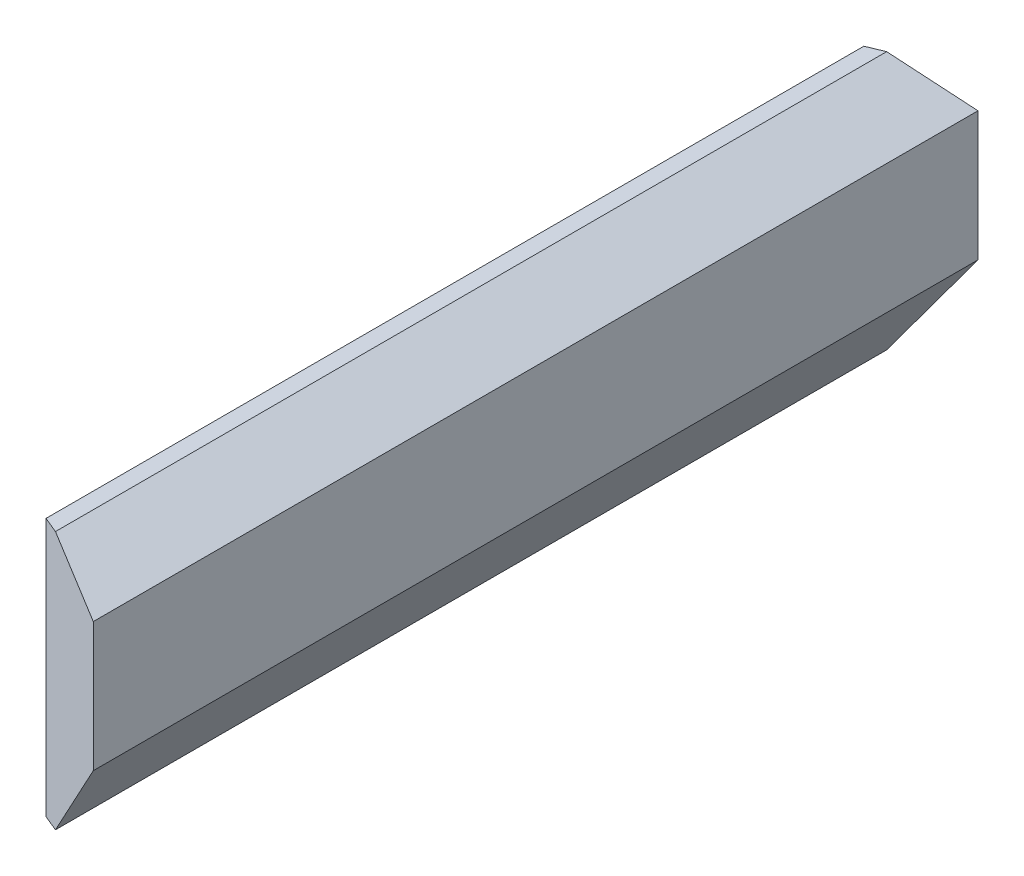
ISO-10303-21;
HEADER;
FILE_DESCRIPTION(('STEP AP214'),'2;1');
FILE_NAME('part.step','',(''),(''),'','','');
FILE_SCHEMA(('AUTOMOTIVE_DESIGN { 1 0 10303 214 1 1 1 1 }'));
ENDSEC;
DATA;
#1=APPLICATION_CONTEXT('core data for automotive mechanical design processes');
#2=APPLICATION_PROTOCOL_DEFINITION('international standard','automotive_design',2000,#1);
#3=PRODUCT_CONTEXT('',#1,'mechanical');
#4=PRODUCT('Part','Part','',(#3));
#5=PRODUCT_RELATED_PRODUCT_CATEGORY('part','',(#4));
#6=PRODUCT_DEFINITION_FORMATION('','',#4);
#7=PRODUCT_DEFINITION_CONTEXT('part definition',#1,'design');
#8=PRODUCT_DEFINITION('design','',#6,#7);
#9=PRODUCT_DEFINITION_SHAPE('','',#8);
#10=(LENGTH_UNIT() NAMED_UNIT(*) SI_UNIT(.MILLI.,.METRE.));
#11=(NAMED_UNIT(*) PLANE_ANGLE_UNIT() SI_UNIT($,.RADIAN.));
#12=(NAMED_UNIT(*) SI_UNIT($,.STERADIAN.) SOLID_ANGLE_UNIT());
#13=UNCERTAINTY_MEASURE_WITH_UNIT(LENGTH_MEASURE(1.E-05),#10,'distance_accuracy_value','');
#14=(GEOMETRIC_REPRESENTATION_CONTEXT(3) GLOBAL_UNCERTAINTY_ASSIGNED_CONTEXT((#13)) GLOBAL_UNIT_ASSIGNED_CONTEXT((#10,
#11,#12)) REPRESENTATION_CONTEXT('',''));
#15=CARTESIAN_POINT('',(0.,0.,0.));
#16=DIRECTION('',(0.,0.,1.));
#17=DIRECTION('',(1.,0.,0.));
#18=AXIS2_PLACEMENT_3D('',#15,#16,#17);
#19=CARTESIAN_POINT('',(0.,0.,300.));
#20=DIRECTION('',(1.,0.,0.));
#21=DIRECTION('',(0.,0.,-1.));
#22=AXIS2_PLACEMENT_3D('',#19,#20,#21);
#23=PLANE('',#22);
#24=DIRECTION('',(0.,0.,1.));
#25=VECTOR('',#24,1.);
#26=CARTESIAN_POINT('',(0.,5.,153.65));
#27=LINE('',#26,#25);
#28=CARTESIAN_POINT('',(0.,5.,153.65));
#29=VERTEX_POINT('',#28);
#30=CARTESIAN_POINT('',(0.,5.,213.65));
#31=VERTEX_POINT('',#30);
#32=EDGE_CURVE('E296',#29,#31,#27,.T.);
#33=ORIENTED_EDGE('',*,*,#32,.F.);
#34=DIRECTION('',(0.,-1.,0.));
#35=VECTOR('',#34,1.);
#36=CARTESIAN_POINT('',(0.,5.,153.65));
#37=LINE('',#36,#35);
#38=CARTESIAN_POINT('',(0.,75.,153.65));
#39=VERTEX_POINT('',#38);
#40=EDGE_CURVE('E325',#39,#29,#37,.T.);
#41=ORIENTED_EDGE('',*,*,#40,.F.);
#42=DIRECTION('',(0.,0.,1.));
#43=VECTOR('',#42,1.);
#44=CARTESIAN_POINT('',(0.,75.,153.65));
#45=LINE('',#44,#43);
#46=CARTESIAN_POINT('',(0.,75.,213.65));
#47=VERTEX_POINT('',#46);
#48=EDGE_CURVE('E346',#39,#47,#45,.T.);
#49=ORIENTED_EDGE('',*,*,#48,.T.);
#50=DIRECTION('',(0.,-1.,0.));
#51=VECTOR('',#50,1.);
#52=CARTESIAN_POINT('',(0.,5.,213.65));
#53=LINE('',#52,#51);
#54=EDGE_CURVE('E309',#47,#31,#53,.T.);
#55=ORIENTED_EDGE('',*,*,#54,.T.);
#56=EDGE_LOOP('',(#33,#41,#49,#55));
#57=FACE_BOUND('',#56,.T.);
#58=DIRECTION('',(0.,-1.,0.));
#59=VECTOR('',#58,1.);
#60=CARTESIAN_POINT('',(0.,5.,146.35));
#61=LINE('',#60,#59);
#62=CARTESIAN_POINT('',(0.,75.,146.35));
#63=VERTEX_POINT('',#62);
#64=CARTESIAN_POINT('',(0.,5.,146.35));
#65=VERTEX_POINT('',#64);
#66=EDGE_CURVE('E439',#63,#65,#61,.T.);
#67=ORIENTED_EDGE('',*,*,#66,.T.);
#68=DIRECTION('',(0.,0.,-1.));
#69=VECTOR('',#68,1.);
#70=CARTESIAN_POINT('',(0.,5.,146.35));
#71=LINE('',#70,#69);
#72=CARTESIAN_POINT('',(0.,5.,86.35));
#73=VERTEX_POINT('',#72);
#74=EDGE_CURVE('E477',#65,#73,#71,.T.);
#75=ORIENTED_EDGE('',*,*,#74,.T.);
#76=DIRECTION('',(0.,-1.,0.));
#77=VECTOR('',#76,1.);
#78=CARTESIAN_POINT('',(0.,5.,86.35));
#79=LINE('',#78,#77);
#80=CARTESIAN_POINT('',(0.,75.,86.35));
#81=VERTEX_POINT('',#80);
#82=EDGE_CURVE('E419',#81,#73,#79,.T.);
#83=ORIENTED_EDGE('',*,*,#82,.F.);
#84=DIRECTION('',(0.,0.,-1.));
#85=VECTOR('',#84,1.);
#86=CARTESIAN_POINT('',(0.,75.,146.35));
#87=LINE('',#86,#85);
#88=EDGE_CURVE('E458',#63,#81,#87,.T.);
#89=ORIENTED_EDGE('',*,*,#88,.F.);
#90=EDGE_LOOP('',(#67,#75,#83,#89));
#91=FACE_BOUND('',#90,.T.);
#92=DIRECTION('',(0.,0.,-1.));
#93=VECTOR('',#92,1.);
#94=CARTESIAN_POINT('',(0.,80.,300.));
#95=LINE('',#94,#93);
#96=CARTESIAN_POINT('',(0.,80.,276.65));
#97=VERTEX_POINT('',#96);
#98=CARTESIAN_POINT('',(0.,80.,23.35));
#99=VERTEX_POINT('',#98);
#100=EDGE_CURVE('E587',#97,#99,#95,.T.);
#101=ORIENTED_EDGE('',*,*,#100,.T.);
#102=DIRECTION('',(0.,1.,0.));
#103=VECTOR('',#102,1.);
#104=CARTESIAN_POINT('',(0.,-210.,23.35));
#105=LINE('',#104,#103);
#106=CARTESIAN_POINT('',(0.,0.,23.35));
#107=VERTEX_POINT('',#106);
#108=EDGE_CURVE('E545',#107,#99,#105,.T.);
#109=ORIENTED_EDGE('',*,*,#108,.F.);
#110=DIRECTION('',(0.,0.,-1.));
#111=VECTOR('',#110,1.);
#112=CARTESIAN_POINT('',(0.,0.,300.));
#113=LINE('',#112,#111);
#114=CARTESIAN_POINT('',(0.,0.,276.65));
#115=VERTEX_POINT('',#114);
#116=EDGE_CURVE('E583',#115,#107,#113,.T.);
#117=ORIENTED_EDGE('',*,*,#116,.F.);
#118=DIRECTION('',(0.,1.,0.));
#119=VECTOR('',#118,1.);
#120=CARTESIAN_POINT('',(0.,-210.,276.65));
#121=LINE('',#120,#119);
#122=EDGE_CURVE('E565',#115,#97,#121,.T.);
#123=ORIENTED_EDGE('',*,*,#122,.T.);
#124=EDGE_LOOP('',(#101,#109,#117,#123));
#125=FACE_BOUND('',#124,.T.);
#126=DIRECTION('',(0.,-1.,0.));
#127=VECTOR('',#126,1.);
#128=CARTESIAN_POINT('',(0.,5.,81.35));
#129=LINE('',#128,#127);
#130=CARTESIAN_POINT('',(0.,75.,81.35));
#131=VERTEX_POINT('',#130);
#132=CARTESIAN_POINT('',(0.,5.,81.35));
#133=VERTEX_POINT('',#132);
#134=EDGE_CURVE('E501',#131,#133,#129,.T.);
#135=ORIENTED_EDGE('',*,*,#134,.T.);
#136=DIRECTION('',(0.,0.,-1.));
#137=VECTOR('',#136,1.);
#138=CARTESIAN_POINT('',(0.,5.,81.35));
#139=LINE('',#138,#137);
#140=CARTESIAN_POINT('',(0.,5.,28.35));
#141=VERTEX_POINT('',#140);
#142=EDGE_CURVE('E538',#133,#141,#139,.T.);
#143=ORIENTED_EDGE('',*,*,#142,.T.);
#144=DIRECTION('',(0.,-1.,0.));
#145=VECTOR('',#144,1.);
#146=CARTESIAN_POINT('',(0.,5.,28.35));
#147=LINE('',#146,#145);
#148=CARTESIAN_POINT('',(0.,75.,28.35));
#149=VERTEX_POINT('',#148);
#150=EDGE_CURVE('E481',#149,#141,#147,.T.);
#151=ORIENTED_EDGE('',*,*,#150,.F.);
#152=DIRECTION('',(0.,0.,-1.));
#153=VECTOR('',#152,1.);
#154=CARTESIAN_POINT('',(0.,75.,81.35));
#155=LINE('',#154,#153);
#156=EDGE_CURVE('E520',#131,#149,#155,.T.);
#157=ORIENTED_EDGE('',*,*,#156,.F.);
#158=EDGE_LOOP('',(#135,#143,#151,#157));
#159=FACE_BOUND('',#158,.T.);
#160=DIRECTION('',(0.,-1.,0.));
#161=VECTOR('',#160,1.);
#162=CARTESIAN_POINT('',(0.,5.,271.65));
#163=LINE('',#162,#161);
#164=CARTESIAN_POINT('',(0.,75.,271.65));
#165=VERTEX_POINT('',#164);
#166=CARTESIAN_POINT('',(0.,5.,271.65));
#167=VERTEX_POINT('',#166);
#168=EDGE_CURVE('E379',#165,#167,#163,.T.);
#169=ORIENTED_EDGE('',*,*,#168,.T.);
#170=DIRECTION('',(0.,0.,-1.));
#171=VECTOR('',#170,1.);
#172=CARTESIAN_POINT('',(0.,5.,271.65));
#173=LINE('',#172,#171);
#174=CARTESIAN_POINT('',(0.,5.,218.65));
#175=VERTEX_POINT('',#174);
#176=EDGE_CURVE('E415',#167,#175,#173,.T.);
#177=ORIENTED_EDGE('',*,*,#176,.T.);
#178=DIRECTION('',(0.,-1.,0.));
#179=VECTOR('',#178,1.);
#180=CARTESIAN_POINT('',(0.,5.,218.65));
#181=LINE('',#180,#179);
#182=CARTESIAN_POINT('',(0.,75.,218.65));
#183=VERTEX_POINT('',#182);
#184=EDGE_CURVE('E350',#183,#175,#181,.T.);
#185=ORIENTED_EDGE('',*,*,#184,.F.);
#186=DIRECTION('',(0.,0.,-1.));
#187=VECTOR('',#186,1.);
#188=CARTESIAN_POINT('',(0.,75.,271.65));
#189=LINE('',#188,#187);
#190=EDGE_CURVE('E70',#165,#183,#189,.T.);
#191=ORIENTED_EDGE('',*,*,#190,.F.);
#192=EDGE_LOOP('',(#169,#177,#185,#191));
#193=FACE_BOUND('',#192,.T.);
#194=ADVANCED_FACE('F40',(#57,#91,#125,#159,#193),#23,.F.);
#195=CARTESIAN_POINT('',(5.,0.,300.));
#196=DIRECTION('',(0.,1.,0.));
#197=DIRECTION('',(-1.,0.,0.));
#198=AXIS2_PLACEMENT_3D('',#195,#196,#197);
#199=PLANE('',#198);
#200=ORIENTED_EDGE('',*,*,#116,.T.);
#201=DIRECTION('',(0.923879532511288,0.,-0.382683432365088));
#202=VECTOR('',#201,1.);
#203=CARTESIAN_POINT('',(-93.5427785546623,0.,62.096687539404));
#204=LINE('',#203,#202);
#205=CARTESIAN_POINT('',(5.,0.,21.2789321881345));
#206=VERTEX_POINT('',#205);
#207=EDGE_CURVE('E558',#107,#206,#204,.T.);
#208=ORIENTED_EDGE('',*,*,#207,.T.);
#209=DIRECTION('',(0.,0.,-1.));
#210=VECTOR('',#209,1.);
#211=CARTESIAN_POINT('',(5.,0.,300.));
#212=LINE('',#211,#210);
#213=CARTESIAN_POINT('',(5.,0.,278.721067811866));
#214=VERTEX_POINT('',#213);
#215=EDGE_CURVE('E11',#214,#206,#212,.T.);
#216=ORIENTED_EDGE('',*,*,#215,.F.);
#217=DIRECTION('',(-0.923879532511285,0.,-0.382683432365094));
#218=VECTOR('',#217,1.);
#219=CARTESIAN_POINT('',(12.5232386233194,0.,281.837295282614));
#220=LINE('',#219,#218);
#221=EDGE_CURVE('E580',#214,#115,#220,.T.);
#222=ORIENTED_EDGE('',*,*,#221,.T.);
#223=EDGE_LOOP('',(#200,#208,#216,#222));
#224=FACE_BOUND('',#223,.T.);
#225=ADVANCED_FACE('F42',(#224),#199,.F.);
#226=CARTESIAN_POINT('',(25.,30.,300.));
#227=DIRECTION('',(-0.832050294337844,0.554700196225229,0.));
#228=DIRECTION('',(-0.554700196225229,-0.832050294337844,0.));
#229=AXIS2_PLACEMENT_3D('',#226,#227,#228);
#230=PLANE('',#229);
#231=ORIENTED_EDGE('',*,*,#215,.T.);
#232=DIRECTION('',(0.540613769225996,0.810920653838994,-0.223929555219045));
#233=VECTOR('',#232,1.);
#234=CARTESIAN_POINT('',(-9.74469439819915,-22.1170415972987,27.3863845809151));
#235=LINE('',#234,#233);
#236=CARTESIAN_POINT('',(25.,30.,12.9946609406727));
#237=VERTEX_POINT('',#236);
#238=EDGE_CURVE('E554',#206,#237,#235,.T.);
#239=ORIENTED_EDGE('',*,*,#238,.T.);
#240=DIRECTION('',(0.,0.,-1.));
#241=VECTOR('',#240,1.);
#242=CARTESIAN_POINT('',(25.,30.,300.));
#243=LINE('',#242,#241);
#244=CARTESIAN_POINT('',(25.,30.,287.005339059328));
#245=VERTEX_POINT('',#244);
#246=EDGE_CURVE('E49',#245,#237,#243,.T.);
#247=ORIENTED_EDGE('',*,*,#246,.F.);
#248=DIRECTION('',(-0.540613769225996,-0.810920653838993,-0.223929555219049));
#249=VECTOR('',#248,1.);
#250=CARTESIAN_POINT('',(26.5731258682214,32.3596888023321,287.656949129265));
#251=LINE('',#250,#249);
#252=EDGE_CURVE('E577',#245,#214,#251,.T.);
#253=ORIENTED_EDGE('',*,*,#252,.T.);
#254=EDGE_LOOP('',(#231,#239,#247,#253));
#255=FACE_BOUND('',#254,.T.);
#256=ADVANCED_FACE('F605',(#255),#230,.F.);
#257=CARTESIAN_POINT('',(25.,70.,300.));
#258=DIRECTION('',(-1.,0.,0.));
#259=DIRECTION('',(0.,-1.,0.));
#260=AXIS2_PLACEMENT_3D('',#257,#258,#259);
#261=PLANE('',#260);
#262=ORIENTED_EDGE('',*,*,#246,.T.);
#263=DIRECTION('',(0.,1.,0.));
#264=VECTOR('',#263,1.);
#265=CARTESIAN_POINT('',(25.,70.,12.9946609406727));
#266=LINE('',#265,#264);
#267=CARTESIAN_POINT('',(25.,70.,12.9946609406727));
#268=VERTEX_POINT('',#267);
#269=EDGE_CURVE('E551',#237,#268,#266,.T.);
#270=ORIENTED_EDGE('',*,*,#269,.T.);
#271=DIRECTION('',(0.,0.,-1.));
#272=VECTOR('',#271,1.);
#273=CARTESIAN_POINT('',(25.,70.,300.));
#274=LINE('',#273,#272);
#275=CARTESIAN_POINT('',(25.,70.,287.005339059328));
#276=VERTEX_POINT('',#275);
#277=EDGE_CURVE('E595',#276,#268,#274,.T.);
#278=ORIENTED_EDGE('',*,*,#277,.F.);
#279=DIRECTION('',(0.,-1.,0.));
#280=VECTOR('',#279,1.);
#281=CARTESIAN_POINT('',(25.,70.,287.005339059328));
#282=LINE('',#281,#280);
#283=EDGE_CURVE('E573',#276,#245,#282,.T.);
#284=ORIENTED_EDGE('',*,*,#283,.T.);
#285=EDGE_LOOP('',(#262,#270,#278,#284));
#286=FACE_BOUND('',#285,.T.);
#287=ADVANCED_FACE('F602',(#286),#261,.F.);
#288=CARTESIAN_POINT('',(5.,80.,300.));
#289=DIRECTION('',(-0.447213595499958,-0.894427190999916,0.));
#290=DIRECTION('',(0.894427190999916,-0.447213595499958,0.));
#291=AXIS2_PLACEMENT_3D('',#288,#289,#290);
#292=PLANE('',#291);
#293=ORIENTED_EDGE('',*,*,#277,.T.);
#294=DIRECTION('',(-0.838716980803311,0.419358490401655,0.347407948441344));
#295=VECTOR('',#294,1.);
#296=CARTESIAN_POINT('',(-76.2128934200243,120.606446710012,54.9184140822691));
#297=LINE('',#296,#295);
#298=CARTESIAN_POINT('',(5.00000000000003,80.,21.2789321881345));
#299=VERTEX_POINT('',#298);
#300=EDGE_CURVE('E548',#268,#299,#297,.T.);
#301=ORIENTED_EDGE('',*,*,#300,.T.);
#302=DIRECTION('',(0.,0.,-1.));
#303=VECTOR('',#302,1.);
#304=CARTESIAN_POINT('',(5.,80.,300.));
#305=LINE('',#304,#303);
#306=CARTESIAN_POINT('',(5.,80.,278.721067811866));
#307=VERTEX_POINT('',#306);
#308=EDGE_CURVE('E591',#307,#299,#305,.T.);
#309=ORIENTED_EDGE('',*,*,#308,.F.);
#310=DIRECTION('',(0.838716980803309,-0.419358490401654,0.34740794844135));
#311=VECTOR('',#310,1.);
#312=CARTESIAN_POINT('',(11.2001902671146,76.8999048664427,281.289270709798));
#313=LINE('',#312,#311);
#314=EDGE_CURVE('E569',#307,#276,#313,.T.);
#315=ORIENTED_EDGE('',*,*,#314,.T.);
#316=EDGE_LOOP('',(#293,#301,#309,#315));
#317=FACE_BOUND('',#316,.T.);
#318=ADVANCED_FACE('F621',(#317),#292,.F.);
#319=CARTESIAN_POINT('',(0.,80.,300.));
#320=DIRECTION('',(0.,-1.,0.));
#321=DIRECTION('',(0.,0.,-1.));
#322=AXIS2_PLACEMENT_3D('',#319,#320,#321);
#323=PLANE('',#322);
#324=ORIENTED_EDGE('',*,*,#308,.T.);
#325=DIRECTION('',(0.923879532511288,0.,-0.382683432365088));
#326=VECTOR('',#325,1.);
#327=CARTESIAN_POINT('',(0.,80.,23.35));
#328=LINE('',#327,#326);
#329=EDGE_CURVE('E542',#99,#299,#328,.T.);
#330=ORIENTED_EDGE('',*,*,#329,.F.);
#331=ORIENTED_EDGE('',*,*,#100,.F.);
#332=DIRECTION('',(-0.923879532511285,0.,-0.382683432365094));
#333=VECTOR('',#332,1.);
#334=CARTESIAN_POINT('',(0.,80.,276.65));
#335=LINE('',#334,#333);
#336=EDGE_CURVE('E562',#307,#97,#335,.T.);
#337=ORIENTED_EDGE('',*,*,#336,.F.);
#338=EDGE_LOOP('',(#324,#330,#331,#337));
#339=FACE_BOUND('',#338,.T.);
#340=ADVANCED_FACE('F617',(#339),#323,.F.);
#341=CARTESIAN_POINT('',(0.,-210.,276.65));
#342=DIRECTION('',(0.382683432365094,0.,-0.923879532511285));
#343=DIRECTION('',(-0.923879532511285,0.,-0.382683432365094));
#344=AXIS2_PLACEMENT_3D('',#341,#342,#343);
#345=PLANE('',#344);
#346=ORIENTED_EDGE('',*,*,#252,.F.);
#347=ORIENTED_EDGE('',*,*,#283,.F.);
#348=ORIENTED_EDGE('',*,*,#314,.F.);
#349=ORIENTED_EDGE('',*,*,#336,.T.);
#350=ORIENTED_EDGE('',*,*,#122,.F.);
#351=ORIENTED_EDGE('',*,*,#221,.F.);
#352=EDGE_LOOP('',(#346,#347,#348,#349,#350,#351));
#353=FACE_BOUND('',#352,.T.);
#354=ADVANCED_FACE('F623',(#353),#345,.F.);
#355=CARTESIAN_POINT('',(0.,-210.,23.35));
#356=DIRECTION('',(0.382683432365088,0.,0.923879532511288));
#357=DIRECTION('',(0.923879532511288,0.,-0.382683432365088));
#358=AXIS2_PLACEMENT_3D('',#355,#356,#357);
#359=PLANE('',#358);
#360=ORIENTED_EDGE('',*,*,#108,.T.);
#361=ORIENTED_EDGE('',*,*,#329,.T.);
#362=ORIENTED_EDGE('',*,*,#300,.F.);
#363=ORIENTED_EDGE('',*,*,#269,.F.);
#364=ORIENTED_EDGE('',*,*,#238,.F.);
#365=ORIENTED_EDGE('',*,*,#207,.F.);
#366=EDGE_LOOP('',(#360,#361,#362,#363,#364,#365));
#367=FACE_BOUND('',#366,.T.);
#368=ADVANCED_FACE('F608',(#367),#359,.F.);
#369=CARTESIAN_POINT('',(3.52593163271468,5.,81.35));
#370=DIRECTION('',(0.,1.,0.));
#371=DIRECTION('',(-1.,0.,0.));
#372=AXIS2_PLACEMENT_3D('',#369,#370,#371);
#373=PLANE('',#372);
#374=DIRECTION('',(1.,0.,0.));
#375=VECTOR('',#374,1.);
#376=CARTESIAN_POINT('',(3.52593163271468,5.,28.35));
#377=LINE('',#376,#375);
#378=CARTESIAN_POINT('',(3.52593163271468,5.,28.35));
#379=VERTEX_POINT('',#378);
#380=EDGE_CURVE('E485',#141,#379,#377,.T.);
#381=ORIENTED_EDGE('',*,*,#380,.F.);
#382=ORIENTED_EDGE('',*,*,#142,.F.);
#383=DIRECTION('',(1.,0.,0.));
#384=VECTOR('',#383,1.);
#385=CARTESIAN_POINT('',(3.52593163271468,5.,81.35));
#386=LINE('',#385,#384);
#387=CARTESIAN_POINT('',(3.52593163271468,5.,81.35));
#388=VERTEX_POINT('',#387);
#389=EDGE_CURVE('E505',#133,#388,#386,.T.);
#390=ORIENTED_EDGE('',*,*,#389,.T.);
#391=DIRECTION('',(0.,0.,-1.));
#392=VECTOR('',#391,1.);
#393=CARTESIAN_POINT('',(3.52593163271468,5.,81.35));
#394=LINE('',#393,#392);
#395=EDGE_CURVE('E534',#388,#379,#394,.T.);
#396=ORIENTED_EDGE('',*,*,#395,.T.);
#397=EDGE_LOOP('',(#381,#382,#390,#396));
#398=FACE_BOUND('',#397,.T.);
#399=ADVANCED_FACE('F630',(#398),#373,.T.);
#400=CARTESIAN_POINT('',(21.,31.211102550928,81.35));
#401=DIRECTION('',(-0.832050294337844,0.554700196225229,0.));
#402=DIRECTION('',(-0.554700196225229,-0.832050294337844,0.));
#403=AXIS2_PLACEMENT_3D('',#400,#401,#402);
#404=PLANE('',#403);
#405=DIRECTION('',(0.554700196225229,0.832050294337844,0.));
#406=VECTOR('',#405,1.);
#407=CARTESIAN_POINT('',(21.,31.211102550928,28.35));
#408=LINE('',#407,#406);
#409=CARTESIAN_POINT('',(21.,31.211102550928,28.35));
#410=VERTEX_POINT('',#409);
#411=EDGE_CURVE('E488',#379,#410,#408,.T.);
#412=ORIENTED_EDGE('',*,*,#411,.F.);
#413=ORIENTED_EDGE('',*,*,#395,.F.);
#414=DIRECTION('',(0.554700196225229,0.832050294337844,0.));
#415=VECTOR('',#414,1.);
#416=CARTESIAN_POINT('',(21.,31.211102550928,81.35));
#417=LINE('',#416,#415);
#418=CARTESIAN_POINT('',(21.,31.211102550928,81.35));
#419=VERTEX_POINT('',#418);
#420=EDGE_CURVE('E508',#388,#419,#417,.T.);
#421=ORIENTED_EDGE('',*,*,#420,.T.);
#422=DIRECTION('',(0.,0.,-1.));
#423=VECTOR('',#422,1.);
#424=CARTESIAN_POINT('',(21.,31.211102550928,81.35));
#425=LINE('',#424,#423);
#426=EDGE_CURVE('E531',#419,#410,#425,.T.);
#427=ORIENTED_EDGE('',*,*,#426,.T.);
#428=EDGE_LOOP('',(#412,#413,#421,#427));
#429=FACE_BOUND('',#428,.T.);
#430=ADVANCED_FACE('F841',(#429),#404,.T.);
#431=CARTESIAN_POINT('',(21.,67.5278640450004,81.35));
#432=DIRECTION('',(-1.,0.,0.));
#433=DIRECTION('',(0.,-1.,0.));
#434=AXIS2_PLACEMENT_3D('',#431,#432,#433);
#435=PLANE('',#434);
#436=DIRECTION('',(0.,1.,0.));
#437=VECTOR('',#436,1.);
#438=CARTESIAN_POINT('',(21.,67.5278640450004,28.35));
#439=LINE('',#438,#437);
#440=CARTESIAN_POINT('',(21.,67.5278640450004,28.35));
#441=VERTEX_POINT('',#440);
#442=EDGE_CURVE('E491',#410,#441,#439,.T.);
#443=ORIENTED_EDGE('',*,*,#442,.F.);
#444=ORIENTED_EDGE('',*,*,#426,.F.);
#445=DIRECTION('',(0.,1.,0.));
#446=VECTOR('',#445,1.);
#447=CARTESIAN_POINT('',(21.,67.5278640450004,81.35));
#448=LINE('',#447,#446);
#449=CARTESIAN_POINT('',(21.,67.5278640450004,81.35));
#450=VERTEX_POINT('',#449);
#451=EDGE_CURVE('E511',#419,#450,#448,.T.);
#452=ORIENTED_EDGE('',*,*,#451,.T.);
#453=DIRECTION('',(0.,0.,-1.));
#454=VECTOR('',#453,1.);
#455=CARTESIAN_POINT('',(21.,67.5278640450004,81.35));
#456=LINE('',#455,#454);
#457=EDGE_CURVE('E527',#450,#441,#456,.T.);
#458=ORIENTED_EDGE('',*,*,#457,.T.);
#459=EDGE_LOOP('',(#443,#444,#452,#458));
#460=FACE_BOUND('',#459,.T.);
#461=ADVANCED_FACE('F837',(#460),#435,.T.);
#462=CARTESIAN_POINT('',(6.05572809000084,75.,81.35));
#463=DIRECTION('',(-0.447213595499958,-0.894427190999916,0.));
#464=DIRECTION('',(0.894427190999916,-0.447213595499958,0.));
#465=AXIS2_PLACEMENT_3D('',#462,#463,#464);
#466=PLANE('',#465);
#467=DIRECTION('',(-0.894427190999916,0.447213595499958,0.));
#468=VECTOR('',#467,1.);
#469=CARTESIAN_POINT('',(6.05572809000084,75.,28.35));
#470=LINE('',#469,#468);
#471=CARTESIAN_POINT('',(6.05572809000084,75.,28.35));
#472=VERTEX_POINT('',#471);
#473=EDGE_CURVE('E494',#441,#472,#470,.T.);
#474=ORIENTED_EDGE('',*,*,#473,.F.);
#475=ORIENTED_EDGE('',*,*,#457,.F.);
#476=DIRECTION('',(-0.894427190999916,0.447213595499958,0.));
#477=VECTOR('',#476,1.);
#478=CARTESIAN_POINT('',(6.05572809000084,75.,81.35));
#479=LINE('',#478,#477);
#480=CARTESIAN_POINT('',(6.05572809000084,75.,81.35));
#481=VERTEX_POINT('',#480);
#482=EDGE_CURVE('E514',#450,#481,#479,.T.);
#483=ORIENTED_EDGE('',*,*,#482,.T.);
#484=DIRECTION('',(0.,0.,-1.));
#485=VECTOR('',#484,1.);
#486=CARTESIAN_POINT('',(6.05572809000084,75.,81.35));
#487=LINE('',#486,#485);
#488=EDGE_CURVE('E523',#481,#472,#487,.T.);
#489=ORIENTED_EDGE('',*,*,#488,.T.);
#490=EDGE_LOOP('',(#474,#475,#483,#489));
#491=FACE_BOUND('',#490,.T.);
#492=ADVANCED_FACE('F833',(#491),#466,.T.);
#493=CARTESIAN_POINT('',(0.,75.,81.35));
#494=DIRECTION('',(0.,-1.,0.));
#495=DIRECTION('',(0.,0.,-1.));
#496=AXIS2_PLACEMENT_3D('',#493,#494,#495);
#497=PLANE('',#496);
#498=DIRECTION('',(-1.,0.,0.));
#499=VECTOR('',#498,1.);
#500=CARTESIAN_POINT('',(0.,75.,28.35));
#501=LINE('',#500,#499);
#502=EDGE_CURVE('E497',#472,#149,#501,.T.);
#503=ORIENTED_EDGE('',*,*,#502,.F.);
#504=ORIENTED_EDGE('',*,*,#488,.F.);
#505=DIRECTION('',(-1.,0.,0.));
#506=VECTOR('',#505,1.);
#507=CARTESIAN_POINT('',(0.,75.,81.35));
#508=LINE('',#507,#506);
#509=EDGE_CURVE('E517',#481,#131,#508,.T.);
#510=ORIENTED_EDGE('',*,*,#509,.T.);
#511=ORIENTED_EDGE('',*,*,#156,.T.);
#512=EDGE_LOOP('',(#503,#504,#510,#511));
#513=FACE_BOUND('',#512,.T.);
#514=ADVANCED_FACE('F829',(#513),#497,.T.);
#515=CARTESIAN_POINT('',(0.,75.,81.35));
#516=DIRECTION('',(0.,0.,-1.));
#517=DIRECTION('',(-1.,0.,0.));
#518=AXIS2_PLACEMENT_3D('',#515,#516,#517);
#519=PLANE('',#518);
#520=ORIENTED_EDGE('',*,*,#134,.F.);
#521=ORIENTED_EDGE('',*,*,#509,.F.);
#522=ORIENTED_EDGE('',*,*,#482,.F.);
#523=ORIENTED_EDGE('',*,*,#451,.F.);
#524=ORIENTED_EDGE('',*,*,#420,.F.);
#525=ORIENTED_EDGE('',*,*,#389,.F.);
#526=EDGE_LOOP('',(#520,#521,#522,#523,#524,#525));
#527=FACE_BOUND('',#526,.T.);
#528=ADVANCED_FACE('F825',(#527),#519,.T.);
#529=CARTESIAN_POINT('',(0.,75.,28.35));
#530=DIRECTION('',(0.,0.,-1.));
#531=DIRECTION('',(-1.,0.,0.));
#532=AXIS2_PLACEMENT_3D('',#529,#530,#531);
#533=PLANE('',#532);
#534=ORIENTED_EDGE('',*,*,#150,.T.);
#535=ORIENTED_EDGE('',*,*,#380,.T.);
#536=ORIENTED_EDGE('',*,*,#411,.T.);
#537=ORIENTED_EDGE('',*,*,#442,.T.);
#538=ORIENTED_EDGE('',*,*,#473,.T.);
#539=ORIENTED_EDGE('',*,*,#502,.T.);
#540=EDGE_LOOP('',(#534,#535,#536,#537,#538,#539));
#541=FACE_BOUND('',#540,.T.);
#542=ADVANCED_FACE('F821',(#541),#533,.F.);
#543=CARTESIAN_POINT('',(3.52593163271468,5.,146.35));
#544=DIRECTION('',(0.,1.,0.));
#545=DIRECTION('',(-1.,0.,0.));
#546=AXIS2_PLACEMENT_3D('',#543,#544,#545);
#547=PLANE('',#546);
#548=DIRECTION('',(1.,0.,0.));
#549=VECTOR('',#548,1.);
#550=CARTESIAN_POINT('',(3.52593163271468,5.,86.35));
#551=LINE('',#550,#549);
#552=CARTESIAN_POINT('',(3.52593163271468,5.,86.35));
#553=VERTEX_POINT('',#552);
#554=EDGE_CURVE('E423',#73,#553,#551,.T.);
#555=ORIENTED_EDGE('',*,*,#554,.F.);
#556=ORIENTED_EDGE('',*,*,#74,.F.);
#557=DIRECTION('',(1.,0.,0.));
#558=VECTOR('',#557,1.);
#559=CARTESIAN_POINT('',(3.52593163271468,5.,146.35));
#560=LINE('',#559,#558);
#561=CARTESIAN_POINT('',(3.52593163271468,5.,146.35));
#562=VERTEX_POINT('',#561);
#563=EDGE_CURVE('E443',#65,#562,#560,.T.);
#564=ORIENTED_EDGE('',*,*,#563,.T.);
#565=DIRECTION('',(0.,0.,-1.));
#566=VECTOR('',#565,1.);
#567=CARTESIAN_POINT('',(3.52593163271468,5.,146.35));
#568=LINE('',#567,#566);
#569=EDGE_CURVE('E473',#562,#553,#568,.T.);
#570=ORIENTED_EDGE('',*,*,#569,.T.);
#571=EDGE_LOOP('',(#555,#556,#564,#570));
#572=FACE_BOUND('',#571,.T.);
#573=ADVANCED_FACE('F817',(#572),#547,.T.);
#574=CARTESIAN_POINT('',(21.,31.211102550928,146.35));
#575=DIRECTION('',(-0.832050294337844,0.554700196225229,0.));
#576=DIRECTION('',(-0.554700196225229,-0.832050294337844,0.));
#577=AXIS2_PLACEMENT_3D('',#574,#575,#576);
#578=PLANE('',#577);
#579=DIRECTION('',(0.554700196225229,0.832050294337844,0.));
#580=VECTOR('',#579,1.);
#581=CARTESIAN_POINT('',(21.,31.211102550928,86.35));
#582=LINE('',#581,#580);
#583=CARTESIAN_POINT('',(21.,31.211102550928,86.35));
#584=VERTEX_POINT('',#583);
#585=EDGE_CURVE('E426',#553,#584,#582,.T.);
#586=ORIENTED_EDGE('',*,*,#585,.F.);
#587=ORIENTED_EDGE('',*,*,#569,.F.);
#588=DIRECTION('',(0.554700196225229,0.832050294337844,0.));
#589=VECTOR('',#588,1.);
#590=CARTESIAN_POINT('',(21.,31.211102550928,146.35));
#591=LINE('',#590,#589);
#592=CARTESIAN_POINT('',(21.,31.211102550928,146.35));
#593=VERTEX_POINT('',#592);
#594=EDGE_CURVE('E446',#562,#593,#591,.T.);
#595=ORIENTED_EDGE('',*,*,#594,.T.);
#596=DIRECTION('',(0.,0.,-1.));
#597=VECTOR('',#596,1.);
#598=CARTESIAN_POINT('',(21.,31.211102550928,146.35));
#599=LINE('',#598,#597);
#600=EDGE_CURVE('E469',#593,#584,#599,.T.);
#601=ORIENTED_EDGE('',*,*,#600,.T.);
#602=EDGE_LOOP('',(#586,#587,#595,#601));
#603=FACE_BOUND('',#602,.T.);
#604=ADVANCED_FACE('F813',(#603),#578,.T.);
#605=CARTESIAN_POINT('',(21.,67.5278640450004,146.35));
#606=DIRECTION('',(-1.,0.,0.));
#607=DIRECTION('',(0.,-1.,0.));
#608=AXIS2_PLACEMENT_3D('',#605,#606,#607);
#609=PLANE('',#608);
#610=DIRECTION('',(0.,1.,0.));
#611=VECTOR('',#610,1.);
#612=CARTESIAN_POINT('',(21.,67.5278640450004,86.35));
#613=LINE('',#612,#611);
#614=CARTESIAN_POINT('',(21.,67.5278640450004,86.35));
#615=VERTEX_POINT('',#614);
#616=EDGE_CURVE('E429',#584,#615,#613,.T.);
#617=ORIENTED_EDGE('',*,*,#616,.F.);
#618=ORIENTED_EDGE('',*,*,#600,.F.);
#619=DIRECTION('',(0.,1.,0.));
#620=VECTOR('',#619,1.);
#621=CARTESIAN_POINT('',(21.,67.5278640450004,146.35));
#622=LINE('',#621,#620);
#623=CARTESIAN_POINT('',(21.,67.5278640450004,146.35));
#624=VERTEX_POINT('',#623);
#625=EDGE_CURVE('E449',#593,#624,#622,.T.);
#626=ORIENTED_EDGE('',*,*,#625,.T.);
#627=DIRECTION('',(0.,0.,-1.));
#628=VECTOR('',#627,1.);
#629=CARTESIAN_POINT('',(21.,67.5278640450004,146.35));
#630=LINE('',#629,#628);
#631=EDGE_CURVE('E465',#624,#615,#630,.T.);
#632=ORIENTED_EDGE('',*,*,#631,.T.);
#633=EDGE_LOOP('',(#617,#618,#626,#632));
#634=FACE_BOUND('',#633,.T.);
#635=ADVANCED_FACE('F682',(#634),#609,.T.);
#636=CARTESIAN_POINT('',(6.05572809000084,75.,146.35));
#637=DIRECTION('',(-0.447213595499958,-0.894427190999916,0.));
#638=DIRECTION('',(0.894427190999916,-0.447213595499958,0.));
#639=AXIS2_PLACEMENT_3D('',#636,#637,#638);
#640=PLANE('',#639);
#641=DIRECTION('',(-0.894427190999916,0.447213595499958,0.));
#642=VECTOR('',#641,1.);
#643=CARTESIAN_POINT('',(6.05572809000084,75.,86.35));
#644=LINE('',#643,#642);
#645=CARTESIAN_POINT('',(6.05572809000084,75.,86.35));
#646=VERTEX_POINT('',#645);
#647=EDGE_CURVE('E432',#615,#646,#644,.T.);
#648=ORIENTED_EDGE('',*,*,#647,.F.);
#649=ORIENTED_EDGE('',*,*,#631,.F.);
#650=DIRECTION('',(-0.894427190999916,0.447213595499958,0.));
#651=VECTOR('',#650,1.);
#652=CARTESIAN_POINT('',(6.05572809000084,75.,146.35));
#653=LINE('',#652,#651);
#654=CARTESIAN_POINT('',(6.05572809000084,75.,146.35));
#655=VERTEX_POINT('',#654);
#656=EDGE_CURVE('E452',#624,#655,#653,.T.);
#657=ORIENTED_EDGE('',*,*,#656,.T.);
#658=DIRECTION('',(0.,0.,-1.));
#659=VECTOR('',#658,1.);
#660=CARTESIAN_POINT('',(6.05572809000084,75.,146.35));
#661=LINE('',#660,#659);
#662=EDGE_CURVE('E461',#655,#646,#661,.T.);
#663=ORIENTED_EDGE('',*,*,#662,.T.);
#664=EDGE_LOOP('',(#648,#649,#657,#663));
#665=FACE_BOUND('',#664,.T.);
#666=ADVANCED_FACE('F671',(#665),#640,.T.);
#667=CARTESIAN_POINT('',(0.,75.,146.35));
#668=DIRECTION('',(0.,-1.,0.));
#669=DIRECTION('',(0.,0.,-1.));
#670=AXIS2_PLACEMENT_3D('',#667,#668,#669);
#671=PLANE('',#670);
#672=DIRECTION('',(-1.,0.,0.));
#673=VECTOR('',#672,1.);
#674=CARTESIAN_POINT('',(0.,75.,86.35));
#675=LINE('',#674,#673);
#676=EDGE_CURVE('E435',#646,#81,#675,.T.);
#677=ORIENTED_EDGE('',*,*,#676,.F.);
#678=ORIENTED_EDGE('',*,*,#662,.F.);
#679=DIRECTION('',(-1.,0.,0.));
#680=VECTOR('',#679,1.);
#681=CARTESIAN_POINT('',(0.,75.,146.35));
#682=LINE('',#681,#680);
#683=EDGE_CURVE('E455',#655,#63,#682,.T.);
#684=ORIENTED_EDGE('',*,*,#683,.T.);
#685=ORIENTED_EDGE('',*,*,#88,.T.);
#686=EDGE_LOOP('',(#677,#678,#684,#685));
#687=FACE_BOUND('',#686,.T.);
#688=ADVANCED_FACE('F666',(#687),#671,.T.);
#689=CARTESIAN_POINT('',(0.,75.,146.35));
#690=DIRECTION('',(0.,0.,-1.));
#691=DIRECTION('',(-1.,0.,0.));
#692=AXIS2_PLACEMENT_3D('',#689,#690,#691);
#693=PLANE('',#692);
#694=ORIENTED_EDGE('',*,*,#66,.F.);
#695=ORIENTED_EDGE('',*,*,#683,.F.);
#696=ORIENTED_EDGE('',*,*,#656,.F.);
#697=ORIENTED_EDGE('',*,*,#625,.F.);
#698=ORIENTED_EDGE('',*,*,#594,.F.);
#699=ORIENTED_EDGE('',*,*,#563,.F.);
#700=EDGE_LOOP('',(#694,#695,#696,#697,#698,#699));
#701=FACE_BOUND('',#700,.T.);
#702=ADVANCED_FACE('F670',(#701),#693,.T.);
#703=CARTESIAN_POINT('',(0.,75.,86.35));
#704=DIRECTION('',(0.,0.,-1.));
#705=DIRECTION('',(-1.,0.,0.));
#706=AXIS2_PLACEMENT_3D('',#703,#704,#705);
#707=PLANE('',#706);
#708=ORIENTED_EDGE('',*,*,#82,.T.);
#709=ORIENTED_EDGE('',*,*,#554,.T.);
#710=ORIENTED_EDGE('',*,*,#585,.T.);
#711=ORIENTED_EDGE('',*,*,#616,.T.);
#712=ORIENTED_EDGE('',*,*,#647,.T.);
#713=ORIENTED_EDGE('',*,*,#676,.T.);
#714=EDGE_LOOP('',(#708,#709,#710,#711,#712,#713));
#715=FACE_BOUND('',#714,.T.);
#716=ADVANCED_FACE('F805',(#715),#707,.F.);
#717=CARTESIAN_POINT('',(3.52593163271468,5.,271.65));
#718=DIRECTION('',(0.,1.,0.));
#719=DIRECTION('',(-1.,0.,0.));
#720=AXIS2_PLACEMENT_3D('',#717,#718,#719);
#721=PLANE('',#720);
#722=DIRECTION('',(1.,0.,0.));
#723=VECTOR('',#722,1.);
#724=CARTESIAN_POINT('',(3.52593163271468,5.,218.65));
#725=LINE('',#724,#723);
#726=CARTESIAN_POINT('',(3.52593163271468,5.,218.65));
#727=VERTEX_POINT('',#726);
#728=EDGE_CURVE('E364',#175,#727,#725,.T.);
#729=ORIENTED_EDGE('',*,*,#728,.F.);
#730=ORIENTED_EDGE('',*,*,#176,.F.);
#731=DIRECTION('',(1.,0.,0.));
#732=VECTOR('',#731,1.);
#733=CARTESIAN_POINT('',(3.52593163271468,5.,271.65));
#734=LINE('',#733,#732);
#735=CARTESIAN_POINT('',(3.52593163271468,5.,271.65));
#736=VERTEX_POINT('',#735);
#737=EDGE_CURVE('E383',#167,#736,#734,.T.);
#738=ORIENTED_EDGE('',*,*,#737,.T.);
#739=DIRECTION('',(0.,0.,-1.));
#740=VECTOR('',#739,1.);
#741=CARTESIAN_POINT('',(3.52593163271468,5.,271.65));
#742=LINE('',#741,#740);
#743=EDGE_CURVE('E411',#736,#727,#742,.T.);
#744=ORIENTED_EDGE('',*,*,#743,.T.);
#745=EDGE_LOOP('',(#729,#730,#738,#744));
#746=FACE_BOUND('',#745,.T.);
#747=ADVANCED_FACE('F801',(#746),#721,.T.);
#748=CARTESIAN_POINT('',(21.,31.211102550928,271.65));
#749=DIRECTION('',(-0.832050294337844,0.554700196225229,0.));
#750=DIRECTION('',(-0.554700196225229,-0.832050294337844,0.));
#751=AXIS2_PLACEMENT_3D('',#748,#749,#750);
#752=PLANE('',#751);
#753=DIRECTION('',(0.554700196225229,0.832050294337844,0.));
#754=VECTOR('',#753,1.);
#755=CARTESIAN_POINT('',(21.,31.211102550928,218.65));
#756=LINE('',#755,#754);
#757=CARTESIAN_POINT('',(21.,31.211102550928,218.65));
#758=VERTEX_POINT('',#757);
#759=EDGE_CURVE('E367',#727,#758,#756,.T.);
#760=ORIENTED_EDGE('',*,*,#759,.F.);
#761=ORIENTED_EDGE('',*,*,#743,.F.);
#762=DIRECTION('',(0.554700196225229,0.832050294337844,0.));
#763=VECTOR('',#762,1.);
#764=CARTESIAN_POINT('',(21.,31.211102550928,271.65));
#765=LINE('',#764,#763);
#766=CARTESIAN_POINT('',(21.,31.211102550928,271.65));
#767=VERTEX_POINT('',#766);
#768=EDGE_CURVE('E385',#736,#767,#765,.T.);
#769=ORIENTED_EDGE('',*,*,#768,.T.);
#770=DIRECTION('',(0.,0.,-1.));
#771=VECTOR('',#770,1.);
#772=CARTESIAN_POINT('',(21.,31.211102550928,271.65));
#773=LINE('',#772,#771);
#774=EDGE_CURVE('E407',#767,#758,#773,.T.);
#775=ORIENTED_EDGE('',*,*,#774,.T.);
#776=EDGE_LOOP('',(#760,#761,#769,#775));
#777=FACE_BOUND('',#776,.T.);
#778=ADVANCED_FACE('F797',(#777),#752,.T.);
#779=CARTESIAN_POINT('',(21.,67.5278640450004,271.65));
#780=DIRECTION('',(-1.,0.,0.));
#781=DIRECTION('',(0.,-1.,0.));
#782=AXIS2_PLACEMENT_3D('',#779,#780,#781);
#783=PLANE('',#782);
#784=DIRECTION('',(0.,1.,0.));
#785=VECTOR('',#784,1.);
#786=CARTESIAN_POINT('',(21.,67.5278640450004,218.65));
#787=LINE('',#786,#785);
#788=CARTESIAN_POINT('',(21.,67.5278640450004,218.65));
#789=VERTEX_POINT('',#788);
#790=EDGE_CURVE('E370',#758,#789,#787,.T.);
#791=ORIENTED_EDGE('',*,*,#790,.F.);
#792=ORIENTED_EDGE('',*,*,#774,.F.);
#793=DIRECTION('',(0.,1.,0.));
#794=VECTOR('',#793,1.);
#795=CARTESIAN_POINT('',(21.,67.5278640450004,271.65));
#796=LINE('',#795,#794);
#797=CARTESIAN_POINT('',(21.,67.5278640450004,271.65));
#798=VERTEX_POINT('',#797);
#799=EDGE_CURVE('E388',#767,#798,#796,.T.);
#800=ORIENTED_EDGE('',*,*,#799,.T.);
#801=DIRECTION('',(0.,0.,-1.));
#802=VECTOR('',#801,1.);
#803=CARTESIAN_POINT('',(21.,67.5278640450004,271.65));
#804=LINE('',#803,#802);
#805=EDGE_CURVE('E403',#798,#789,#804,.T.);
#806=ORIENTED_EDGE('',*,*,#805,.T.);
#807=EDGE_LOOP('',(#791,#792,#800,#806));
#808=FACE_BOUND('',#807,.T.);
#809=ADVANCED_FACE('F794',(#808),#783,.T.);
#810=CARTESIAN_POINT('',(6.05572809000084,75.,271.65));
#811=DIRECTION('',(-0.447213595499958,-0.894427190999916,0.));
#812=DIRECTION('',(0.894427190999916,-0.447213595499958,0.));
#813=AXIS2_PLACEMENT_3D('',#810,#811,#812);
#814=PLANE('',#813);
#815=DIRECTION('',(-0.894427190999916,0.447213595499958,0.));
#816=VECTOR('',#815,1.);
#817=CARTESIAN_POINT('',(6.05572809000084,75.,218.65));
#818=LINE('',#817,#816);
#819=CARTESIAN_POINT('',(6.05572809000084,75.,218.65));
#820=VERTEX_POINT('',#819);
#821=EDGE_CURVE('E373',#789,#820,#818,.T.);
#822=ORIENTED_EDGE('',*,*,#821,.F.);
#823=ORIENTED_EDGE('',*,*,#805,.F.);
#824=DIRECTION('',(-0.894427190999916,0.447213595499958,0.));
#825=VECTOR('',#824,1.);
#826=CARTESIAN_POINT('',(6.05572809000084,75.,271.65));
#827=LINE('',#826,#825);
#828=CARTESIAN_POINT('',(6.05572809000084,75.,271.65));
#829=VERTEX_POINT('',#828);
#830=EDGE_CURVE('E391',#798,#829,#827,.T.);
#831=ORIENTED_EDGE('',*,*,#830,.T.);
#832=DIRECTION('',(0.,0.,-1.));
#833=VECTOR('',#832,1.);
#834=CARTESIAN_POINT('',(6.05572809000084,75.,271.65));
#835=LINE('',#834,#833);
#836=EDGE_CURVE('E399',#829,#820,#835,.T.);
#837=ORIENTED_EDGE('',*,*,#836,.T.);
#838=EDGE_LOOP('',(#822,#823,#831,#837));
#839=FACE_BOUND('',#838,.T.);
#840=ADVANCED_FACE('F714',(#839),#814,.T.);
#841=CARTESIAN_POINT('',(0.,75.,271.65));
#842=DIRECTION('',(0.,-1.,0.));
#843=DIRECTION('',(0.,0.,-1.));
#844=AXIS2_PLACEMENT_3D('',#841,#842,#843);
#845=PLANE('',#844);
#846=DIRECTION('',(-1.,0.,0.));
#847=VECTOR('',#846,1.);
#848=CARTESIAN_POINT('',(0.,75.,218.65));
#849=LINE('',#848,#847);
#850=EDGE_CURVE('E376',#820,#183,#849,.T.);
#851=ORIENTED_EDGE('',*,*,#850,.F.);
#852=ORIENTED_EDGE('',*,*,#836,.F.);
#853=DIRECTION('',(-1.,0.,0.));
#854=VECTOR('',#853,1.);
#855=CARTESIAN_POINT('',(0.,75.,271.65));
#856=LINE('',#855,#854);
#857=EDGE_CURVE('E394',#829,#165,#856,.T.);
#858=ORIENTED_EDGE('',*,*,#857,.T.);
#859=ORIENTED_EDGE('',*,*,#190,.T.);
#860=EDGE_LOOP('',(#851,#852,#858,#859));
#861=FACE_BOUND('',#860,.T.);
#862=ADVANCED_FACE('F710',(#861),#845,.T.);
#863=CARTESIAN_POINT('',(0.,75.,271.65));
#864=DIRECTION('',(0.,0.,-1.));
#865=DIRECTION('',(-1.,0.,0.));
#866=AXIS2_PLACEMENT_3D('',#863,#864,#865);
#867=PLANE('',#866);
#868=ORIENTED_EDGE('',*,*,#168,.F.);
#869=ORIENTED_EDGE('',*,*,#857,.F.);
#870=ORIENTED_EDGE('',*,*,#830,.F.);
#871=ORIENTED_EDGE('',*,*,#799,.F.);
#872=ORIENTED_EDGE('',*,*,#768,.F.);
#873=ORIENTED_EDGE('',*,*,#737,.F.);
#874=EDGE_LOOP('',(#868,#869,#870,#871,#872,#873));
#875=FACE_BOUND('',#874,.T.);
#876=ADVANCED_FACE('F713',(#875),#867,.T.);
#877=CARTESIAN_POINT('',(0.,75.,218.65));
#878=DIRECTION('',(0.,0.,-1.));
#879=DIRECTION('',(-1.,0.,0.));
#880=AXIS2_PLACEMENT_3D('',#877,#878,#879);
#881=PLANE('',#880);
#882=ORIENTED_EDGE('',*,*,#184,.T.);
#883=ORIENTED_EDGE('',*,*,#728,.T.);
#884=ORIENTED_EDGE('',*,*,#759,.T.);
#885=ORIENTED_EDGE('',*,*,#790,.T.);
#886=ORIENTED_EDGE('',*,*,#821,.T.);
#887=ORIENTED_EDGE('',*,*,#850,.T.);
#888=EDGE_LOOP('',(#882,#883,#884,#885,#886,#887));
#889=FACE_BOUND('',#888,.T.);
#890=ADVANCED_FACE('F694',(#889),#881,.F.);
#891=CARTESIAN_POINT('',(0.,75.,153.65));
#892=DIRECTION('',(0.,1.,0.));
#893=DIRECTION('',(0.,0.,1.));
#894=AXIS2_PLACEMENT_3D('',#891,#892,#893);
#895=PLANE('',#894);
#896=DIRECTION('',(-1.,0.,0.));
#897=VECTOR('',#896,1.);
#898=CARTESIAN_POINT('',(0.,75.,213.65));
#899=LINE('',#898,#897);
#900=CARTESIAN_POINT('',(6.05572809000084,75.,213.65));
#901=VERTEX_POINT('',#900);
#902=EDGE_CURVE('E321',#901,#47,#899,.T.);
#903=ORIENTED_EDGE('',*,*,#902,.T.);
#904=ORIENTED_EDGE('',*,*,#48,.F.);
#905=DIRECTION('',(-1.,0.,0.));
#906=VECTOR('',#905,1.);
#907=CARTESIAN_POINT('',(0.,75.,153.65));
#908=LINE('',#907,#906);
#909=CARTESIAN_POINT('',(6.05572809000084,75.,153.65));
#910=VERTEX_POINT('',#909);
#911=EDGE_CURVE('E342',#910,#39,#908,.T.);
#912=ORIENTED_EDGE('',*,*,#911,.F.);
#913=DIRECTION('',(0.,0.,1.));
#914=VECTOR('',#913,1.);
#915=CARTESIAN_POINT('',(6.05572809000084,75.,153.65));
#916=LINE('',#915,#914);
#917=EDGE_CURVE('E351',#910,#901,#916,.T.);
#918=ORIENTED_EDGE('',*,*,#917,.T.);
#919=EDGE_LOOP('',(#903,#904,#912,#918));
#920=FACE_BOUND('',#919,.T.);
#921=ADVANCED_FACE('F690',(#920),#895,.F.);
#922=CARTESIAN_POINT('',(6.05572809000084,75.,153.65));
#923=DIRECTION('',(0.447213595499958,0.894427190999916,0.));
#924=DIRECTION('',(-0.894427190999916,0.447213595499958,0.));
#925=AXIS2_PLACEMENT_3D('',#922,#923,#924);
#926=PLANE('',#925);
#927=DIRECTION('',(-0.894427190999916,0.447213595499958,0.));
#928=VECTOR('',#927,1.);
#929=CARTESIAN_POINT('',(6.05572809000084,75.,213.65));
#930=LINE('',#929,#928);
#931=CARTESIAN_POINT('',(21.,67.5278640450004,213.65));
#932=VERTEX_POINT('',#931);
#933=EDGE_CURVE('E317',#932,#901,#930,.T.);
#934=ORIENTED_EDGE('',*,*,#933,.T.);
#935=ORIENTED_EDGE('',*,*,#917,.F.);
#936=DIRECTION('',(-0.894427190999916,0.447213595499958,0.));
#937=VECTOR('',#936,1.);
#938=CARTESIAN_POINT('',(6.05572809000084,75.,153.65));
#939=LINE('',#938,#937);
#940=CARTESIAN_POINT('',(21.,67.5278640450004,153.65));
#941=VERTEX_POINT('',#940);
#942=EDGE_CURVE('E338',#941,#910,#939,.T.);
#943=ORIENTED_EDGE('',*,*,#942,.F.);
#944=DIRECTION('',(0.,0.,1.));
#945=VECTOR('',#944,1.);
#946=CARTESIAN_POINT('',(21.,67.5278640450004,153.65));
#947=LINE('',#946,#945);
#948=EDGE_CURVE('E354',#941,#932,#947,.T.);
#949=ORIENTED_EDGE('',*,*,#948,.T.);
#950=EDGE_LOOP('',(#934,#935,#943,#949));
#951=FACE_BOUND('',#950,.T.);
#952=ADVANCED_FACE('F693',(#951),#926,.F.);
#953=CARTESIAN_POINT('',(21.,67.5278640450004,153.65));
#954=DIRECTION('',(1.,0.,0.));
#955=DIRECTION('',(0.,1.,0.));
#956=AXIS2_PLACEMENT_3D('',#953,#954,#955);
#957=PLANE('',#956);
#958=DIRECTION('',(0.,1.,0.));
#959=VECTOR('',#958,1.);
#960=CARTESIAN_POINT('',(21.,67.5278640450004,213.65));
#961=LINE('',#960,#959);
#962=CARTESIAN_POINT('',(21.,31.211102550928,213.65));
#963=VERTEX_POINT('',#962);
#964=EDGE_CURVE('E302',#963,#932,#961,.T.);
#965=ORIENTED_EDGE('',*,*,#964,.T.);
#966=ORIENTED_EDGE('',*,*,#948,.F.);
#967=DIRECTION('',(0.,1.,0.));
#968=VECTOR('',#967,1.);
#969=CARTESIAN_POINT('',(21.,67.5278640450004,153.65));
#970=LINE('',#969,#968);
#971=CARTESIAN_POINT('',(21.,31.211102550928,153.65));
#972=VERTEX_POINT('',#971);
#973=EDGE_CURVE('E334',#972,#941,#970,.T.);
#974=ORIENTED_EDGE('',*,*,#973,.F.);
#975=DIRECTION('',(0.,0.,1.));
#976=VECTOR('',#975,1.);
#977=CARTESIAN_POINT('',(21.,31.211102550928,153.65));
#978=LINE('',#977,#976);
#979=EDGE_CURVE('E295',#972,#963,#978,.T.);
#980=ORIENTED_EDGE('',*,*,#979,.T.);
#981=EDGE_LOOP('',(#965,#966,#974,#980));
#982=FACE_BOUND('',#981,.T.);
#983=ADVANCED_FACE('F745',(#982),#957,.F.);
#984=CARTESIAN_POINT('',(21.,31.211102550928,153.65));
#985=DIRECTION('',(0.832050294337844,-0.554700196225229,0.));
#986=DIRECTION('',(0.554700196225229,0.832050294337844,0.));
#987=AXIS2_PLACEMENT_3D('',#984,#985,#986);
#988=PLANE('',#987);
#989=DIRECTION('',(0.554700196225229,0.832050294337844,0.));
#990=VECTOR('',#989,1.);
#991=CARTESIAN_POINT('',(21.,31.211102550928,213.65));
#992=LINE('',#991,#990);
#993=CARTESIAN_POINT('',(3.52593163271468,5.,213.65));
#994=VERTEX_POINT('',#993);
#995=EDGE_CURVE('E289',#994,#963,#992,.T.);
#996=ORIENTED_EDGE('',*,*,#995,.T.);
#997=ORIENTED_EDGE('',*,*,#979,.F.);
#998=DIRECTION('',(0.554700196225229,0.832050294337844,0.));
#999=VECTOR('',#998,1.);
#1000=CARTESIAN_POINT('',(21.,31.211102550928,153.65));
#1001=LINE('',#1000,#999);
#1002=CARTESIAN_POINT('',(3.52593163271468,5.,153.65));
#1003=VERTEX_POINT('',#1002);
#1004=EDGE_CURVE('E291',#1003,#972,#1001,.T.);
#1005=ORIENTED_EDGE('',*,*,#1004,.F.);
#1006=DIRECTION('',(0.,0.,1.));
#1007=VECTOR('',#1006,1.);
#1008=CARTESIAN_POINT('',(3.52593163271468,5.,153.65));
#1009=LINE('',#1008,#1007);
#1010=EDGE_CURVE('E287',#1003,#994,#1009,.T.);
#1011=ORIENTED_EDGE('',*,*,#1010,.T.);
#1012=EDGE_LOOP('',(#996,#997,#1005,#1011));
#1013=FACE_BOUND('',#1012,.T.);
#1014=ADVANCED_FACE('F288',(#1013),#988,.F.);
#1015=CARTESIAN_POINT('',(3.52593163271468,5.,153.65));
#1016=DIRECTION('',(0.,-1.,0.));
#1017=DIRECTION('',(1.,0.,0.));
#1018=AXIS2_PLACEMENT_3D('',#1015,#1016,#1017);
#1019=PLANE('',#1018);
#1020=DIRECTION('',(1.,0.,0.));
#1021=VECTOR('',#1020,1.);
#1022=CARTESIAN_POINT('',(3.52593163271468,5.,213.65));
#1023=LINE('',#1022,#1021);
#1024=EDGE_CURVE('E59',#31,#994,#1023,.T.);
#1025=ORIENTED_EDGE('',*,*,#1024,.T.);
#1026=ORIENTED_EDGE('',*,*,#1010,.F.);
#1027=DIRECTION('',(1.,0.,0.));
#1028=VECTOR('',#1027,1.);
#1029=CARTESIAN_POINT('',(3.52593163271468,5.,153.65));
#1030=LINE('',#1029,#1028);
#1031=EDGE_CURVE('E329',#29,#1003,#1030,.T.);
#1032=ORIENTED_EDGE('',*,*,#1031,.F.);
#1033=ORIENTED_EDGE('',*,*,#32,.T.);
#1034=EDGE_LOOP('',(#1025,#1026,#1032,#1033));
#1035=FACE_BOUND('',#1034,.T.);
#1036=ADVANCED_FACE('F305',(#1035),#1019,.F.);
#1037=CARTESIAN_POINT('',(0.,75.,153.65));
#1038=DIRECTION('',(0.,0.,-1.));
#1039=DIRECTION('',(-1.,0.,0.));
#1040=AXIS2_PLACEMENT_3D('',#1037,#1038,#1039);
#1041=PLANE('',#1040);
#1042=ORIENTED_EDGE('',*,*,#40,.T.);
#1043=ORIENTED_EDGE('',*,*,#1031,.T.);
#1044=ORIENTED_EDGE('',*,*,#1004,.T.);
#1045=ORIENTED_EDGE('',*,*,#973,.T.);
#1046=ORIENTED_EDGE('',*,*,#942,.T.);
#1047=ORIENTED_EDGE('',*,*,#911,.T.);
#1048=EDGE_LOOP('',(#1042,#1043,#1044,#1045,#1046,#1047));
#1049=FACE_BOUND('',#1048,.T.);
#1050=ADVANCED_FACE('F769',(#1049),#1041,.F.);
#1051=CARTESIAN_POINT('',(0.,75.,213.65));
#1052=DIRECTION('',(0.,0.,-1.));
#1053=DIRECTION('',(-1.,0.,0.));
#1054=AXIS2_PLACEMENT_3D('',#1051,#1052,#1053);
#1055=PLANE('',#1054);
#1056=ORIENTED_EDGE('',*,*,#54,.F.);
#1057=ORIENTED_EDGE('',*,*,#902,.F.);
#1058=ORIENTED_EDGE('',*,*,#933,.F.);
#1059=ORIENTED_EDGE('',*,*,#964,.F.);
#1060=ORIENTED_EDGE('',*,*,#995,.F.);
#1061=ORIENTED_EDGE('',*,*,#1024,.F.);
#1062=EDGE_LOOP('',(#1056,#1057,#1058,#1059,#1060,#1061));
#1063=FACE_BOUND('',#1062,.T.);
#1064=ADVANCED_FACE('F299',(#1063),#1055,.T.);
#1065=CLOSED_SHELL('',(#194,#225,#256,#287,#318,#340,#354,#368,#399,#430,#461,#492,#514,#528,
#542,#573,#604,#635,#666,#688,#702,#716,#747,#778,#809,#840,#862,#876,#890,#921,#952,#983,#1014,
#1036,#1050,#1064));
#1066=MANIFOLD_SOLID_BREP('B2',#1065);
#1067=ADVANCED_BREP_SHAPE_REPRESENTATION('',(#18,#1066),#14);
#1068=SHAPE_DEFINITION_REPRESENTATION(#9,#1067);
ENDSEC;
END-ISO-10303-21;
